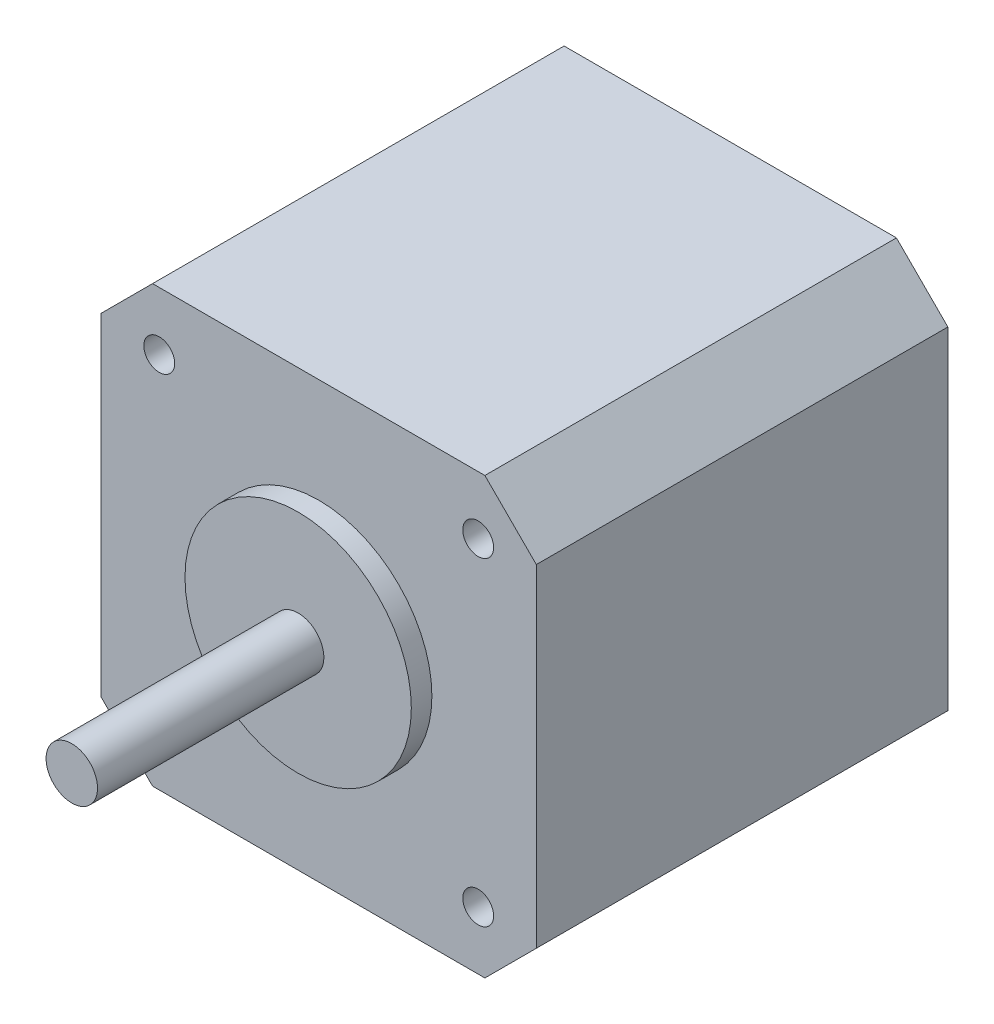
ISO-10303-21;
HEADER;
FILE_DESCRIPTION(('STEP AP214'),'2;1');
FILE_NAME('part.step','',(''),(''),'','','');
FILE_SCHEMA(('AUTOMOTIVE_DESIGN { 1 0 10303 214 1 1 1 1 }'));
ENDSEC;
DATA;
#1=APPLICATION_CONTEXT('core data for automotive mechanical design processes');
#2=APPLICATION_PROTOCOL_DEFINITION('international standard','automotive_design',2000,#1);
#3=PRODUCT_CONTEXT('',#1,'mechanical');
#4=PRODUCT('Part','Part','',(#3));
#5=PRODUCT_RELATED_PRODUCT_CATEGORY('part','',(#4));
#6=PRODUCT_DEFINITION_FORMATION('','',#4);
#7=PRODUCT_DEFINITION_CONTEXT('part definition',#1,'design');
#8=PRODUCT_DEFINITION('design','',#6,#7);
#9=PRODUCT_DEFINITION_SHAPE('','',#8);
#10=(LENGTH_UNIT() NAMED_UNIT(*) SI_UNIT(.MILLI.,.METRE.));
#11=(NAMED_UNIT(*) PLANE_ANGLE_UNIT() SI_UNIT($,.RADIAN.));
#12=(NAMED_UNIT(*) SI_UNIT($,.STERADIAN.) SOLID_ANGLE_UNIT());
#13=UNCERTAINTY_MEASURE_WITH_UNIT(LENGTH_MEASURE(1.E-05),#10,'distance_accuracy_value','');
#14=(GEOMETRIC_REPRESENTATION_CONTEXT(3) GLOBAL_UNCERTAINTY_ASSIGNED_CONTEXT((#13)) GLOBAL_UNIT_ASSIGNED_CONTEXT((#10,
#11,#12)) REPRESENTATION_CONTEXT('',''));
#15=CARTESIAN_POINT('',(0.,0.,0.));
#16=DIRECTION('',(0.,0.,1.));
#17=DIRECTION('',(1.,0.,0.));
#18=AXIS2_PLACEMENT_3D('',#15,#16,#17);
#19=CARTESIAN_POINT('',(-21.15,-21.15,-40.));
#20=DIRECTION('',(0.,-1.,0.));
#21=DIRECTION('',(0.,0.,-1.));
#22=AXIS2_PLACEMENT_3D('',#19,#20,#21);
#23=PLANE('',#22);
#24=DIRECTION('',(1.,0.,0.));
#25=VECTOR('',#24,1.);
#26=CARTESIAN_POINT('',(-21.15,-21.15,0.));
#27=LINE('',#26,#25);
#28=CARTESIAN_POINT('',(-16.15,-21.15,0.));
#29=VERTEX_POINT('',#28);
#30=CARTESIAN_POINT('',(16.15,-21.15,0.));
#31=VERTEX_POINT('',#30);
#32=EDGE_CURVE('E202',#29,#31,#27,.T.);
#33=ORIENTED_EDGE('',*,*,#32,.F.);
#34=DIRECTION('',(0.,0.,-1.));
#35=VECTOR('',#34,1.);
#36=CARTESIAN_POINT('',(-16.15,-21.15,-40.));
#37=LINE('',#36,#35);
#38=CARTESIAN_POINT('',(-16.15,-21.15,-40.));
#39=VERTEX_POINT('',#38);
#40=EDGE_CURVE('E228',#29,#39,#37,.T.);
#41=ORIENTED_EDGE('',*,*,#40,.T.);
#42=DIRECTION('',(1.,0.,0.));
#43=VECTOR('',#42,1.);
#44=CARTESIAN_POINT('',(-21.15,-21.15,-40.));
#45=LINE('',#44,#43);
#46=CARTESIAN_POINT('',(16.15,-21.15,-40.));
#47=VERTEX_POINT('',#46);
#48=EDGE_CURVE('E190',#39,#47,#45,.T.);
#49=ORIENTED_EDGE('',*,*,#48,.T.);
#50=DIRECTION('',(0.,0.,1.));
#51=VECTOR('',#50,1.);
#52=CARTESIAN_POINT('',(16.15,-21.15,-40.));
#53=LINE('',#52,#51);
#54=EDGE_CURVE('E225',#47,#31,#53,.T.);
#55=ORIENTED_EDGE('',*,*,#54,.T.);
#56=EDGE_LOOP('',(#33,#41,#49,#55));
#57=FACE_BOUND('',#56,.T.);
#58=DIRECTION('',(1.,0.,0.));
#59=VECTOR('',#58,1.);
#60=CARTESIAN_POINT('',(-2.5,-21.15,-37.));
#61=LINE('',#60,#59);
#62=CARTESIAN_POINT('',(-2.5,-21.15,-37.));
#63=VERTEX_POINT('',#62);
#64=CARTESIAN_POINT('',(2.5,-21.15,-37.));
#65=VERTEX_POINT('',#64);
#66=EDGE_CURVE('E516',#63,#65,#61,.T.);
#67=ORIENTED_EDGE('',*,*,#66,.F.);
#68=DIRECTION('',(0.,0.,-1.));
#69=VECTOR('',#68,1.);
#70=CARTESIAN_POINT('',(-2.5,-21.15,-32.));
#71=LINE('',#70,#69);
#72=CARTESIAN_POINT('',(-2.5,-21.15,-32.));
#73=VERTEX_POINT('',#72);
#74=EDGE_CURVE('E147',#73,#63,#71,.T.);
#75=ORIENTED_EDGE('',*,*,#74,.F.);
#76=DIRECTION('',(-1.,0.,0.));
#77=VECTOR('',#76,1.);
#78=CARTESIAN_POINT('',(-2.5,-21.15,-32.));
#79=LINE('',#78,#77);
#80=CARTESIAN_POINT('',(2.5,-21.15,-32.));
#81=VERTEX_POINT('',#80);
#82=EDGE_CURVE('E143',#81,#73,#79,.T.);
#83=ORIENTED_EDGE('',*,*,#82,.F.);
#84=DIRECTION('',(0.,0.,1.));
#85=VECTOR('',#84,1.);
#86=CARTESIAN_POINT('',(2.5,-21.15,-32.));
#87=LINE('',#86,#85);
#88=EDGE_CURVE('E513',#65,#81,#87,.T.);
#89=ORIENTED_EDGE('',*,*,#88,.F.);
#90=EDGE_LOOP('',(#67,#75,#83,#89));
#91=FACE_BOUND('',#90,.T.);
#92=ADVANCED_FACE('F34',(#57,#91),#23,.T.);
#93=CARTESIAN_POINT('',(0.,0.,2.));
#94=DIRECTION('',(0.,0.,1.));
#95=DIRECTION('',(1.,0.,0.));
#96=AXIS2_PLACEMENT_3D('',#93,#94,#95);
#97=PLANE('',#96);
#98=CARTESIAN_POINT('',(0.,0.,2.));
#99=DIRECTION('',(0.,0.,1.));
#100=DIRECTION('',(1.,0.,0.));
#101=AXIS2_PLACEMENT_3D('',#98,#99,#100);
#102=CIRCLE('',#101,11.);
#103=CARTESIAN_POINT('',(11.,0.,2.));
#104=VERTEX_POINT('',#103);
#105=EDGE_CURVE('E181',#104,#104,#102,.T.);
#106=ORIENTED_EDGE('',*,*,#105,.T.);
#107=EDGE_LOOP('',(#106));
#108=FACE_BOUND('',#107,.T.);
#109=CARTESIAN_POINT('',(0.,0.,2.));
#110=DIRECTION('',(0.,0.,1.));
#111=DIRECTION('',(1.,0.,0.));
#112=AXIS2_PLACEMENT_3D('',#109,#110,#111);
#113=CIRCLE('',#112,2.5);
#114=CARTESIAN_POINT('',(2.5,0.,2.));
#115=VERTEX_POINT('',#114);
#116=EDGE_CURVE('E175',#115,#115,#113,.T.);
#117=ORIENTED_EDGE('',*,*,#116,.F.);
#118=EDGE_LOOP('',(#117));
#119=FACE_BOUND('',#118,.T.);
#120=ADVANCED_FACE('F285',(#108,#119),#97,.T.);
#121=CARTESIAN_POINT('',(-21.15,21.15,0.));
#122=DIRECTION('',(0.,0.,-1.));
#123=DIRECTION('',(-1.,0.,0.));
#124=AXIS2_PLACEMENT_3D('',#121,#122,#123);
#125=PLANE('',#124);
#126=CARTESIAN_POINT('',(-15.5,-15.5,0.));
#127=DIRECTION('',(0.,0.,1.));
#128=DIRECTION('',(1.,0.,0.));
#129=AXIS2_PLACEMENT_3D('',#126,#127,#128);
#130=CIRCLE('',#129,1.5);
#131=CARTESIAN_POINT('',(-14.,-15.5,0.));
#132=VERTEX_POINT('',#131);
#133=EDGE_CURVE('E149',#132,#132,#130,.T.);
#134=ORIENTED_EDGE('',*,*,#133,.F.);
#135=EDGE_LOOP('',(#134));
#136=FACE_BOUND('',#135,.T.);
#137=CARTESIAN_POINT('',(15.5,-15.5,0.));
#138=DIRECTION('',(0.,0.,1.));
#139=DIRECTION('',(1.,0.,0.));
#140=AXIS2_PLACEMENT_3D('',#137,#138,#139);
#141=CIRCLE('',#140,1.5);
#142=CARTESIAN_POINT('',(17.,-15.5,0.));
#143=VERTEX_POINT('',#142);
#144=EDGE_CURVE('E158',#143,#143,#141,.T.);
#145=ORIENTED_EDGE('',*,*,#144,.F.);
#146=EDGE_LOOP('',(#145));
#147=FACE_BOUND('',#146,.T.);
#148=CARTESIAN_POINT('',(15.5,15.5,0.));
#149=DIRECTION('',(0.,0.,1.));
#150=DIRECTION('',(1.,0.,0.));
#151=AXIS2_PLACEMENT_3D('',#148,#149,#150);
#152=CIRCLE('',#151,1.49999999999999);
#153=CARTESIAN_POINT('',(17.,15.5,0.));
#154=VERTEX_POINT('',#153);
#155=EDGE_CURVE('E163',#154,#154,#152,.T.);
#156=ORIENTED_EDGE('',*,*,#155,.F.);
#157=EDGE_LOOP('',(#156));
#158=FACE_BOUND('',#157,.T.);
#159=CARTESIAN_POINT('',(-15.5,15.5,0.));
#160=DIRECTION('',(0.,0.,1.));
#161=DIRECTION('',(1.,0.,0.));
#162=AXIS2_PLACEMENT_3D('',#159,#160,#161);
#163=CIRCLE('',#162,1.5);
#164=CARTESIAN_POINT('',(-14.,15.5,0.));
#165=VERTEX_POINT('',#164);
#166=EDGE_CURVE('E169',#165,#165,#163,.T.);
#167=ORIENTED_EDGE('',*,*,#166,.F.);
#168=EDGE_LOOP('',(#167));
#169=FACE_BOUND('',#168,.T.);
#170=DIRECTION('',(0.,-1.,0.));
#171=VECTOR('',#170,1.);
#172=CARTESIAN_POINT('',(-21.15,-21.15,0.));
#173=LINE('',#172,#171);
#174=CARTESIAN_POINT('',(-21.15,16.15,0.));
#175=VERTEX_POINT('',#174);
#176=CARTESIAN_POINT('',(-21.15,-16.15,0.));
#177=VERTEX_POINT('',#176);
#178=EDGE_CURVE('E186',#175,#177,#173,.T.);
#179=ORIENTED_EDGE('',*,*,#178,.T.);
#180=DIRECTION('',(-0.707106781186549,0.707106781186546,0.));
#181=VECTOR('',#180,1.);
#182=CARTESIAN_POINT('',(-21.15,-16.15,0.));
#183=LINE('',#182,#181);
#184=EDGE_CURVE('E223',#177,#29,#183,.F.);
#185=ORIENTED_EDGE('',*,*,#184,.T.);
#186=ORIENTED_EDGE('',*,*,#32,.T.);
#187=DIRECTION('',(-0.707106781186546,-0.707106781186549,0.));
#188=VECTOR('',#187,1.);
#189=CARTESIAN_POINT('',(16.15,-21.15,0.));
#190=LINE('',#189,#188);
#191=CARTESIAN_POINT('',(21.15,-16.15,0.));
#192=VERTEX_POINT('',#191);
#193=EDGE_CURVE('E221',#31,#192,#190,.F.);
#194=ORIENTED_EDGE('',*,*,#193,.T.);
#195=DIRECTION('',(0.,1.,0.));
#196=VECTOR('',#195,1.);
#197=CARTESIAN_POINT('',(21.15,-21.15,0.));
#198=LINE('',#197,#196);
#199=CARTESIAN_POINT('',(21.15,16.15,0.));
#200=VERTEX_POINT('',#199);
#201=EDGE_CURVE('E205',#192,#200,#198,.T.);
#202=ORIENTED_EDGE('',*,*,#201,.T.);
#203=DIRECTION('',(0.707106781186549,-0.707106781186546,0.));
#204=VECTOR('',#203,1.);
#205=CARTESIAN_POINT('',(21.15,16.15,0.));
#206=LINE('',#205,#204);
#207=CARTESIAN_POINT('',(16.15,21.15,0.));
#208=VERTEX_POINT('',#207);
#209=EDGE_CURVE('E219',#200,#208,#206,.F.);
#210=ORIENTED_EDGE('',*,*,#209,.T.);
#211=DIRECTION('',(-1.,0.,0.));
#212=VECTOR('',#211,1.);
#213=CARTESIAN_POINT('',(-21.15,21.15,0.));
#214=LINE('',#213,#212);
#215=CARTESIAN_POINT('',(-16.15,21.15,0.));
#216=VERTEX_POINT('',#215);
#217=EDGE_CURVE('E191',#208,#216,#214,.T.);
#218=ORIENTED_EDGE('',*,*,#217,.T.);
#219=DIRECTION('',(0.707106781186546,0.707106781186549,0.));
#220=VECTOR('',#219,1.);
#221=CARTESIAN_POINT('',(-16.15,21.15,0.));
#222=LINE('',#221,#220);
#223=EDGE_CURVE('E217',#216,#175,#222,.F.);
#224=ORIENTED_EDGE('',*,*,#223,.T.);
#225=EDGE_LOOP('',(#179,#185,#186,#194,#202,#210,#218,#224));
#226=FACE_BOUND('',#225,.T.);
#227=CARTESIAN_POINT('',(0.,0.,0.));
#228=DIRECTION('',(0.,0.,-1.));
#229=DIRECTION('',(-1.,0.,0.));
#230=AXIS2_PLACEMENT_3D('',#227,#228,#229);
#231=CIRCLE('',#230,11.);
#232=CARTESIAN_POINT('',(-11.,0.,0.));
#233=VERTEX_POINT('',#232);
#234=EDGE_CURVE('E199',#233,#233,#231,.F.);
#235=ORIENTED_EDGE('',*,*,#234,.F.);
#236=EDGE_LOOP('',(#235));
#237=FACE_BOUND('',#236,.T.);
#238=ADVANCED_FACE('F250',(#136,#147,#158,#169,#226,#237),#125,.F.);
#239=CARTESIAN_POINT('',(-21.15,-21.15,-40.));
#240=DIRECTION('',(-1.,0.,0.));
#241=DIRECTION('',(0.,-1.,0.));
#242=AXIS2_PLACEMENT_3D('',#239,#240,#241);
#243=PLANE('',#242);
#244=DIRECTION('',(0.,-1.,0.));
#245=VECTOR('',#244,1.);
#246=CARTESIAN_POINT('',(-21.15,-21.15,-40.));
#247=LINE('',#246,#245);
#248=CARTESIAN_POINT('',(-21.15,16.15,-40.));
#249=VERTEX_POINT('',#248);
#250=CARTESIAN_POINT('',(-21.15,-16.15,-40.));
#251=VERTEX_POINT('',#250);
#252=EDGE_CURVE('E187',#249,#251,#247,.T.);
#253=ORIENTED_EDGE('',*,*,#252,.T.);
#254=DIRECTION('',(0.,0.,1.));
#255=VECTOR('',#254,1.);
#256=CARTESIAN_POINT('',(-21.15,-16.15,-40.));
#257=LINE('',#256,#255);
#258=EDGE_CURVE('E214',#251,#177,#257,.T.);
#259=ORIENTED_EDGE('',*,*,#258,.T.);
#260=ORIENTED_EDGE('',*,*,#178,.F.);
#261=DIRECTION('',(0.,0.,-1.));
#262=VECTOR('',#261,1.);
#263=CARTESIAN_POINT('',(-21.15,16.15,-40.));
#264=LINE('',#263,#262);
#265=EDGE_CURVE('E212',#175,#249,#264,.T.);
#266=ORIENTED_EDGE('',*,*,#265,.T.);
#267=EDGE_LOOP('',(#253,#259,#260,#266));
#268=FACE_BOUND('',#267,.T.);
#269=ADVANCED_FACE('F275',(#268),#243,.T.);
#270=CARTESIAN_POINT('',(-21.15,21.15,-40.));
#271=DIRECTION('',(0.,1.,0.));
#272=DIRECTION('',(0.,0.,1.));
#273=AXIS2_PLACEMENT_3D('',#270,#271,#272);
#274=PLANE('',#273);
#275=ORIENTED_EDGE('',*,*,#217,.F.);
#276=DIRECTION('',(0.,0.,-1.));
#277=VECTOR('',#276,1.);
#278=CARTESIAN_POINT('',(16.15,21.15,-40.));
#279=LINE('',#278,#277);
#280=CARTESIAN_POINT('',(16.15,21.15,-40.));
#281=VERTEX_POINT('',#280);
#282=EDGE_CURVE('E11',#208,#281,#279,.T.);
#283=ORIENTED_EDGE('',*,*,#282,.T.);
#284=DIRECTION('',(-1.,0.,0.));
#285=VECTOR('',#284,1.);
#286=CARTESIAN_POINT('',(-21.15,21.15,-40.));
#287=LINE('',#286,#285);
#288=CARTESIAN_POINT('',(-16.15,21.15,-40.));
#289=VERTEX_POINT('',#288);
#290=EDGE_CURVE('E196',#281,#289,#287,.T.);
#291=ORIENTED_EDGE('',*,*,#290,.T.);
#292=DIRECTION('',(0.,0.,1.));
#293=VECTOR('',#292,1.);
#294=CARTESIAN_POINT('',(-16.15,21.15,-40.));
#295=LINE('',#294,#293);
#296=EDGE_CURVE('E42',#289,#216,#295,.T.);
#297=ORIENTED_EDGE('',*,*,#296,.T.);
#298=EDGE_LOOP('',(#275,#283,#291,#297));
#299=FACE_BOUND('',#298,.T.);
#300=ADVANCED_FACE('F245',(#299),#274,.T.);
#301=CARTESIAN_POINT('',(21.15,-21.15,-40.));
#302=DIRECTION('',(1.,0.,0.));
#303=DIRECTION('',(0.,1.,0.));
#304=AXIS2_PLACEMENT_3D('',#301,#302,#303);
#305=PLANE('',#304);
#306=ORIENTED_EDGE('',*,*,#201,.F.);
#307=DIRECTION('',(0.,0.,-1.));
#308=VECTOR('',#307,1.);
#309=CARTESIAN_POINT('',(21.15,-16.15,-40.));
#310=LINE('',#309,#308);
#311=CARTESIAN_POINT('',(21.15,-16.15,-40.));
#312=VERTEX_POINT('',#311);
#313=EDGE_CURVE('E240',#192,#312,#310,.T.);
#314=ORIENTED_EDGE('',*,*,#313,.T.);
#315=DIRECTION('',(0.,1.,0.));
#316=VECTOR('',#315,1.);
#317=CARTESIAN_POINT('',(21.15,-21.15,-40.));
#318=LINE('',#317,#316);
#319=CARTESIAN_POINT('',(21.15,16.15,-40.));
#320=VERTEX_POINT('',#319);
#321=EDGE_CURVE('E194',#312,#320,#318,.T.);
#322=ORIENTED_EDGE('',*,*,#321,.T.);
#323=DIRECTION('',(0.,0.,1.));
#324=VECTOR('',#323,1.);
#325=CARTESIAN_POINT('',(21.15,16.15,-40.));
#326=LINE('',#325,#324);
#327=EDGE_CURVE('E237',#320,#200,#326,.T.);
#328=ORIENTED_EDGE('',*,*,#327,.T.);
#329=EDGE_LOOP('',(#306,#314,#322,#328));
#330=FACE_BOUND('',#329,.T.);
#331=ADVANCED_FACE('F258',(#330),#305,.T.);
#332=CARTESIAN_POINT('',(-21.15,21.15,-40.));
#333=DIRECTION('',(0.,0.,-1.));
#334=DIRECTION('',(-1.,0.,0.));
#335=AXIS2_PLACEMENT_3D('',#332,#333,#334);
#336=PLANE('',#335);
#337=ORIENTED_EDGE('',*,*,#48,.F.);
#338=DIRECTION('',(0.707106781186549,-0.707106781186546,0.));
#339=VECTOR('',#338,1.);
#340=CARTESIAN_POINT('',(-39.8,2.49999999999991,-40.));
#341=LINE('',#340,#339);
#342=EDGE_CURVE('E235',#39,#251,#341,.F.);
#343=ORIENTED_EDGE('',*,*,#342,.T.);
#344=ORIENTED_EDGE('',*,*,#252,.F.);
#345=DIRECTION('',(-0.707106781186546,-0.707106781186549,0.));
#346=VECTOR('',#345,1.);
#347=CARTESIAN_POINT('',(-18.65,18.65,-40.));
#348=LINE('',#347,#346);
#349=EDGE_CURVE('E230',#249,#289,#348,.F.);
#350=ORIENTED_EDGE('',*,*,#349,.T.);
#351=ORIENTED_EDGE('',*,*,#290,.F.);
#352=DIRECTION('',(-0.707106781186549,0.707106781186546,0.));
#353=VECTOR('',#352,1.);
#354=CARTESIAN_POINT('',(-2.50000000000009,39.8,-40.));
#355=LINE('',#354,#353);
#356=EDGE_CURVE('E57',#281,#320,#355,.F.);
#357=ORIENTED_EDGE('',*,*,#356,.T.);
#358=ORIENTED_EDGE('',*,*,#321,.F.);
#359=DIRECTION('',(0.707106781186546,0.707106781186549,0.));
#360=VECTOR('',#359,1.);
#361=CARTESIAN_POINT('',(18.6500000000001,-18.6499999999999,-40.));
#362=LINE('',#361,#360);
#363=EDGE_CURVE('E233',#312,#47,#362,.F.);
#364=ORIENTED_EDGE('',*,*,#363,.T.);
#365=EDGE_LOOP('',(#337,#343,#344,#350,#351,#357,#358,#364));
#366=FACE_BOUND('',#365,.T.);
#367=ADVANCED_FACE('F262',(#366),#336,.T.);
#368=CARTESIAN_POINT('',(0.,0.,2.));
#369=DIRECTION('',(0.,0.,-1.));
#370=DIRECTION('',(-1.,0.,0.));
#371=AXIS2_PLACEMENT_3D('',#368,#369,#370);
#372=CYLINDRICAL_SURFACE('',#371,11.);
#373=ORIENTED_EDGE('',*,*,#105,.F.);
#374=EDGE_LOOP('',(#373));
#375=FACE_BOUND('',#374,.T.);
#376=ORIENTED_EDGE('',*,*,#234,.T.);
#377=EDGE_LOOP('',(#376));
#378=FACE_BOUND('',#377,.T.);
#379=ADVANCED_FACE('F331',(#375,#378),#372,.T.);
#380=CARTESIAN_POINT('',(0.,0.,24.));
#381=DIRECTION('',(0.,0.,-1.));
#382=DIRECTION('',(-1.,0.,0.));
#383=AXIS2_PLACEMENT_3D('',#380,#381,#382);
#384=CYLINDRICAL_SURFACE('',#383,2.5);
#385=CARTESIAN_POINT('',(0.,0.,24.));
#386=DIRECTION('',(0.,0.,1.));
#387=DIRECTION('',(1.,0.,0.));
#388=AXIS2_PLACEMENT_3D('',#385,#386,#387);
#389=CIRCLE('',#388,2.5);
#390=CARTESIAN_POINT('',(2.5,0.,24.));
#391=VERTEX_POINT('',#390);
#392=EDGE_CURVE('E178',#391,#391,#389,.T.);
#393=ORIENTED_EDGE('',*,*,#392,.F.);
#394=EDGE_LOOP('',(#393));
#395=FACE_BOUND('',#394,.T.);
#396=ORIENTED_EDGE('',*,*,#116,.T.);
#397=EDGE_LOOP('',(#396));
#398=FACE_BOUND('',#397,.T.);
#399=ADVANCED_FACE('F339',(#395,#398),#384,.T.);
#400=CARTESIAN_POINT('',(0.,0.,24.));
#401=DIRECTION('',(0.,0.,1.));
#402=DIRECTION('',(1.,0.,0.));
#403=AXIS2_PLACEMENT_3D('',#400,#401,#402);
#404=PLANE('',#403);
#405=ORIENTED_EDGE('',*,*,#392,.T.);
#406=EDGE_LOOP('',(#405));
#407=FACE_BOUND('',#406,.T.);
#408=ADVANCED_FACE('F348',(#407),#404,.T.);
#409=CARTESIAN_POINT('',(-15.5,15.5,-4.5));
#410=DIRECTION('',(0.,0.,1.));
#411=DIRECTION('',(1.,0.,0.));
#412=AXIS2_PLACEMENT_3D('',#409,#410,#411);
#413=CYLINDRICAL_SURFACE('',#412,1.5);
#414=CARTESIAN_POINT('',(-15.5,15.5,-4.5));
#415=DIRECTION('',(0.,0.,1.));
#416=DIRECTION('',(1.,0.,0.));
#417=AXIS2_PLACEMENT_3D('',#414,#415,#416);
#418=CIRCLE('',#417,1.5);
#419=CARTESIAN_POINT('',(-14.,15.5,-4.5));
#420=VERTEX_POINT('',#419);
#421=EDGE_CURVE('E172',#420,#420,#418,.T.);
#422=ORIENTED_EDGE('',*,*,#421,.F.);
#423=EDGE_LOOP('',(#422));
#424=FACE_BOUND('',#423,.T.);
#425=ORIENTED_EDGE('',*,*,#166,.T.);
#426=EDGE_LOOP('',(#425));
#427=FACE_BOUND('',#426,.T.);
#428=ADVANCED_FACE('F356',(#424,#427),#413,.F.);
#429=CARTESIAN_POINT('',(-15.5,15.5,-4.5));
#430=DIRECTION('',(0.,0.,1.));
#431=DIRECTION('',(1.,0.,0.));
#432=AXIS2_PLACEMENT_3D('',#429,#430,#431);
#433=PLANE('',#432);
#434=ORIENTED_EDGE('',*,*,#421,.T.);
#435=EDGE_LOOP('',(#434));
#436=FACE_BOUND('',#435,.T.);
#437=ADVANCED_FACE('F364',(#436),#433,.T.);
#438=CARTESIAN_POINT('',(15.5,15.5,-4.5));
#439=DIRECTION('',(0.,0.,1.));
#440=DIRECTION('',(1.,0.,0.));
#441=AXIS2_PLACEMENT_3D('',#438,#439,#440);
#442=CYLINDRICAL_SURFACE('',#441,1.49999999999999);
#443=CARTESIAN_POINT('',(15.5,15.5,-4.5));
#444=DIRECTION('',(0.,0.,1.));
#445=DIRECTION('',(1.,0.,0.));
#446=AXIS2_PLACEMENT_3D('',#443,#444,#445);
#447=CIRCLE('',#446,1.49999999999999);
#448=CARTESIAN_POINT('',(17.,15.5,-4.5));
#449=VERTEX_POINT('',#448);
#450=EDGE_CURVE('E166',#449,#449,#447,.T.);
#451=ORIENTED_EDGE('',*,*,#450,.F.);
#452=EDGE_LOOP('',(#451));
#453=FACE_BOUND('',#452,.T.);
#454=ORIENTED_EDGE('',*,*,#155,.T.);
#455=EDGE_LOOP('',(#454));
#456=FACE_BOUND('',#455,.T.);
#457=ADVANCED_FACE('F372',(#453,#456),#442,.F.);
#458=CARTESIAN_POINT('',(15.5,15.5,-4.5));
#459=DIRECTION('',(0.,0.,1.));
#460=DIRECTION('',(1.,0.,0.));
#461=AXIS2_PLACEMENT_3D('',#458,#459,#460);
#462=PLANE('',#461);
#463=ORIENTED_EDGE('',*,*,#450,.T.);
#464=EDGE_LOOP('',(#463));
#465=FACE_BOUND('',#464,.T.);
#466=ADVANCED_FACE('F380',(#465),#462,.T.);
#467=CARTESIAN_POINT('',(15.5,-15.5,-4.5));
#468=DIRECTION('',(0.,0.,1.));
#469=DIRECTION('',(1.,0.,0.));
#470=AXIS2_PLACEMENT_3D('',#467,#468,#469);
#471=CYLINDRICAL_SURFACE('',#470,1.5);
#472=CARTESIAN_POINT('',(15.5,-15.5,-4.5));
#473=DIRECTION('',(0.,0.,1.));
#474=DIRECTION('',(1.,0.,0.));
#475=AXIS2_PLACEMENT_3D('',#472,#473,#474);
#476=CIRCLE('',#475,1.5);
#477=CARTESIAN_POINT('',(17.,-15.5,-4.5));
#478=VERTEX_POINT('',#477);
#479=EDGE_CURVE('E160',#478,#478,#476,.T.);
#480=ORIENTED_EDGE('',*,*,#479,.F.);
#481=EDGE_LOOP('',(#480));
#482=FACE_BOUND('',#481,.T.);
#483=ORIENTED_EDGE('',*,*,#144,.T.);
#484=EDGE_LOOP('',(#483));
#485=FACE_BOUND('',#484,.T.);
#486=ADVANCED_FACE('F388',(#482,#485),#471,.F.);
#487=CARTESIAN_POINT('',(15.5,-15.5,-4.5));
#488=DIRECTION('',(0.,0.,1.));
#489=DIRECTION('',(1.,0.,0.));
#490=AXIS2_PLACEMENT_3D('',#487,#488,#489);
#491=PLANE('',#490);
#492=ORIENTED_EDGE('',*,*,#479,.T.);
#493=EDGE_LOOP('',(#492));
#494=FACE_BOUND('',#493,.T.);
#495=ADVANCED_FACE('F396',(#494),#491,.T.);
#496=CARTESIAN_POINT('',(-15.5,-15.5,-4.5));
#497=DIRECTION('',(0.,0.,1.));
#498=DIRECTION('',(1.,0.,0.));
#499=AXIS2_PLACEMENT_3D('',#496,#497,#498);
#500=CYLINDRICAL_SURFACE('',#499,1.5);
#501=CARTESIAN_POINT('',(-15.5,-15.5,-4.5));
#502=DIRECTION('',(0.,0.,1.));
#503=DIRECTION('',(1.,0.,0.));
#504=AXIS2_PLACEMENT_3D('',#501,#502,#503);
#505=CIRCLE('',#504,1.5);
#506=CARTESIAN_POINT('',(-14.,-15.5,-4.5));
#507=VERTEX_POINT('',#506);
#508=EDGE_CURVE('E152',#507,#507,#505,.T.);
#509=ORIENTED_EDGE('',*,*,#508,.F.);
#510=EDGE_LOOP('',(#509));
#511=FACE_BOUND('',#510,.T.);
#512=ORIENTED_EDGE('',*,*,#133,.T.);
#513=EDGE_LOOP('',(#512));
#514=FACE_BOUND('',#513,.T.);
#515=ADVANCED_FACE('F404',(#511,#514),#500,.F.);
#516=CARTESIAN_POINT('',(-15.5,-15.5,-4.5));
#517=DIRECTION('',(0.,0.,1.));
#518=DIRECTION('',(1.,0.,0.));
#519=AXIS2_PLACEMENT_3D('',#516,#517,#518);
#520=PLANE('',#519);
#521=ORIENTED_EDGE('',*,*,#508,.T.);
#522=EDGE_LOOP('',(#521));
#523=FACE_BOUND('',#522,.T.);
#524=ADVANCED_FACE('F299',(#523),#520,.T.);
#525=CARTESIAN_POINT('',(-21.15,-16.15,-40.));
#526=DIRECTION('',(0.707106781186546,0.707106781186549,0.));
#527=DIRECTION('',(-0.707106781186549,0.707106781186546,0.));
#528=AXIS2_PLACEMENT_3D('',#525,#526,#527);
#529=PLANE('',#528);
#530=ORIENTED_EDGE('',*,*,#342,.F.);
#531=ORIENTED_EDGE('',*,*,#40,.F.);
#532=ORIENTED_EDGE('',*,*,#184,.F.);
#533=ORIENTED_EDGE('',*,*,#258,.F.);
#534=EDGE_LOOP('',(#530,#531,#532,#533));
#535=FACE_BOUND('',#534,.T.);
#536=ADVANCED_FACE('F273',(#535),#529,.F.);
#537=CARTESIAN_POINT('',(16.15,-21.15,-40.));
#538=DIRECTION('',(-0.707106781186549,0.707106781186546,0.));
#539=DIRECTION('',(-0.707106781186546,-0.707106781186549,0.));
#540=AXIS2_PLACEMENT_3D('',#537,#538,#539);
#541=PLANE('',#540);
#542=ORIENTED_EDGE('',*,*,#363,.F.);
#543=ORIENTED_EDGE('',*,*,#313,.F.);
#544=ORIENTED_EDGE('',*,*,#193,.F.);
#545=ORIENTED_EDGE('',*,*,#54,.F.);
#546=EDGE_LOOP('',(#542,#543,#544,#545));
#547=FACE_BOUND('',#546,.T.);
#548=ADVANCED_FACE('F265',(#547),#541,.F.);
#549=CARTESIAN_POINT('',(21.15,16.15,-40.));
#550=DIRECTION('',(-0.707106781186546,-0.707106781186549,0.));
#551=DIRECTION('',(0.707106781186549,-0.707106781186546,0.));
#552=AXIS2_PLACEMENT_3D('',#549,#550,#551);
#553=PLANE('',#552);
#554=ORIENTED_EDGE('',*,*,#356,.F.);
#555=ORIENTED_EDGE('',*,*,#282,.F.);
#556=ORIENTED_EDGE('',*,*,#209,.F.);
#557=ORIENTED_EDGE('',*,*,#327,.F.);
#558=EDGE_LOOP('',(#554,#555,#556,#557));
#559=FACE_BOUND('',#558,.T.);
#560=ADVANCED_FACE('F256',(#559),#553,.F.);
#561=CARTESIAN_POINT('',(-16.15,21.15,-40.));
#562=DIRECTION('',(0.707106781186549,-0.707106781186546,0.));
#563=DIRECTION('',(0.707106781186546,0.707106781186549,0.));
#564=AXIS2_PLACEMENT_3D('',#561,#562,#563);
#565=PLANE('',#564);
#566=ORIENTED_EDGE('',*,*,#349,.F.);
#567=ORIENTED_EDGE('',*,*,#265,.F.);
#568=ORIENTED_EDGE('',*,*,#223,.F.);
#569=ORIENTED_EDGE('',*,*,#296,.F.);
#570=EDGE_LOOP('',(#566,#567,#568,#569));
#571=FACE_BOUND('',#570,.T.);
#572=ADVANCED_FACE('F36',(#571),#565,.F.);
#573=CARTESIAN_POINT('',(-2.5,-22.15,-32.));
#574=DIRECTION('',(1.,0.,0.));
#575=DIRECTION('',(0.,0.,-1.));
#576=AXIS2_PLACEMENT_3D('',#573,#574,#575);
#577=PLANE('',#576);
#578=ORIENTED_EDGE('',*,*,#74,.T.);
#579=DIRECTION('',(0.,1.,0.));
#580=VECTOR('',#579,1.);
#581=CARTESIAN_POINT('',(-2.5,-22.15,-37.));
#582=LINE('',#581,#580);
#583=CARTESIAN_POINT('',(-2.5,-22.15,-37.));
#584=VERTEX_POINT('',#583);
#585=EDGE_CURVE('E128',#584,#63,#582,.T.);
#586=ORIENTED_EDGE('',*,*,#585,.F.);
#587=DIRECTION('',(0.,0.,-1.));
#588=VECTOR('',#587,1.);
#589=CARTESIAN_POINT('',(-2.5,-22.15,-32.));
#590=LINE('',#589,#588);
#591=CARTESIAN_POINT('',(-2.5,-22.15,-32.));
#592=VERTEX_POINT('',#591);
#593=EDGE_CURVE('E135',#592,#584,#590,.T.);
#594=ORIENTED_EDGE('',*,*,#593,.F.);
#595=DIRECTION('',(0.,1.,0.));
#596=VECTOR('',#595,1.);
#597=CARTESIAN_POINT('',(-2.5,-22.15,-32.));
#598=LINE('',#597,#596);
#599=EDGE_CURVE('E511',#592,#73,#598,.T.);
#600=ORIENTED_EDGE('',*,*,#599,.T.);
#601=EDGE_LOOP('',(#578,#586,#594,#600));
#602=FACE_BOUND('',#601,.T.);
#603=ADVANCED_FACE('F145',(#602),#577,.F.);
#604=CARTESIAN_POINT('',(-2.5,-22.15,-37.));
#605=DIRECTION('',(0.,0.,1.));
#606=DIRECTION('',(1.,0.,0.));
#607=AXIS2_PLACEMENT_3D('',#604,#605,#606);
#608=PLANE('',#607);
#609=ORIENTED_EDGE('',*,*,#66,.T.);
#610=DIRECTION('',(0.,1.,0.));
#611=VECTOR('',#610,1.);
#612=CARTESIAN_POINT('',(2.5,-22.15,-37.));
#613=LINE('',#612,#611);
#614=CARTESIAN_POINT('',(2.5,-22.15,-37.));
#615=VERTEX_POINT('',#614);
#616=EDGE_CURVE('E131',#615,#65,#613,.T.);
#617=ORIENTED_EDGE('',*,*,#616,.F.);
#618=DIRECTION('',(1.,0.,0.));
#619=VECTOR('',#618,1.);
#620=CARTESIAN_POINT('',(-2.5,-22.15,-37.));
#621=LINE('',#620,#619);
#622=EDGE_CURVE('E124',#584,#615,#621,.T.);
#623=ORIENTED_EDGE('',*,*,#622,.F.);
#624=ORIENTED_EDGE('',*,*,#585,.T.);
#625=EDGE_LOOP('',(#609,#617,#623,#624));
#626=FACE_BOUND('',#625,.T.);
#627=ADVANCED_FACE('F126',(#626),#608,.F.);
#628=CARTESIAN_POINT('',(2.5,-22.15,-32.));
#629=DIRECTION('',(-1.,0.,0.));
#630=DIRECTION('',(0.,0.,1.));
#631=AXIS2_PLACEMENT_3D('',#628,#629,#630);
#632=PLANE('',#631);
#633=ORIENTED_EDGE('',*,*,#88,.T.);
#634=DIRECTION('',(0.,1.,0.));
#635=VECTOR('',#634,1.);
#636=CARTESIAN_POINT('',(2.5,-22.15,-32.));
#637=LINE('',#636,#635);
#638=CARTESIAN_POINT('',(2.5,-22.15,-32.));
#639=VERTEX_POINT('',#638);
#640=EDGE_CURVE('E49',#639,#81,#637,.T.);
#641=ORIENTED_EDGE('',*,*,#640,.F.);
#642=DIRECTION('',(0.,0.,1.));
#643=VECTOR('',#642,1.);
#644=CARTESIAN_POINT('',(2.5,-22.15,-32.));
#645=LINE('',#644,#643);
#646=EDGE_CURVE('E134',#615,#639,#645,.T.);
#647=ORIENTED_EDGE('',*,*,#646,.F.);
#648=ORIENTED_EDGE('',*,*,#616,.T.);
#649=EDGE_LOOP('',(#633,#641,#647,#648));
#650=FACE_BOUND('',#649,.T.);
#651=ADVANCED_FACE('F451',(#650),#632,.F.);
#652=CARTESIAN_POINT('',(-2.5,-22.15,-32.));
#653=DIRECTION('',(0.,0.,-1.));
#654=DIRECTION('',(-1.,0.,0.));
#655=AXIS2_PLACEMENT_3D('',#652,#653,#654);
#656=PLANE('',#655);
#657=ORIENTED_EDGE('',*,*,#82,.T.);
#658=ORIENTED_EDGE('',*,*,#599,.F.);
#659=DIRECTION('',(-1.,0.,0.));
#660=VECTOR('',#659,1.);
#661=CARTESIAN_POINT('',(-2.5,-22.15,-32.));
#662=LINE('',#661,#660);
#663=EDGE_CURVE('E139',#639,#592,#662,.T.);
#664=ORIENTED_EDGE('',*,*,#663,.F.);
#665=ORIENTED_EDGE('',*,*,#640,.T.);
#666=EDGE_LOOP('',(#657,#658,#664,#665));
#667=FACE_BOUND('',#666,.T.);
#668=ADVANCED_FACE('F454',(#667),#656,.F.);
#669=CARTESIAN_POINT('',(-2.5,-22.15,-37.));
#670=DIRECTION('',(0.,-1.,0.));
#671=DIRECTION('',(0.,0.,-1.));
#672=AXIS2_PLACEMENT_3D('',#669,#670,#671);
#673=PLANE('',#672);
#674=ORIENTED_EDGE('',*,*,#593,.T.);
#675=ORIENTED_EDGE('',*,*,#622,.T.);
#676=ORIENTED_EDGE('',*,*,#646,.T.);
#677=ORIENTED_EDGE('',*,*,#663,.T.);
#678=EDGE_LOOP('',(#674,#675,#676,#677));
#679=FACE_BOUND('',#678,.T.);
#680=ADVANCED_FACE('F138',(#679),#673,.T.);
#681=CLOSED_SHELL('',(#92,#120,#238,#269,#300,#331,#367,#379,#399,#408,#428,#437,#457,#466,#486,
#495,#515,#524,#536,#548,#560,#572,#603,#627,#651,#668,#680));
#682=MANIFOLD_SOLID_BREP('B2',#681);
#683=ADVANCED_BREP_SHAPE_REPRESENTATION('',(#18,#682),#14);
#684=SHAPE_DEFINITION_REPRESENTATION(#9,#683);
ENDSEC;
END-ISO-10303-21;
